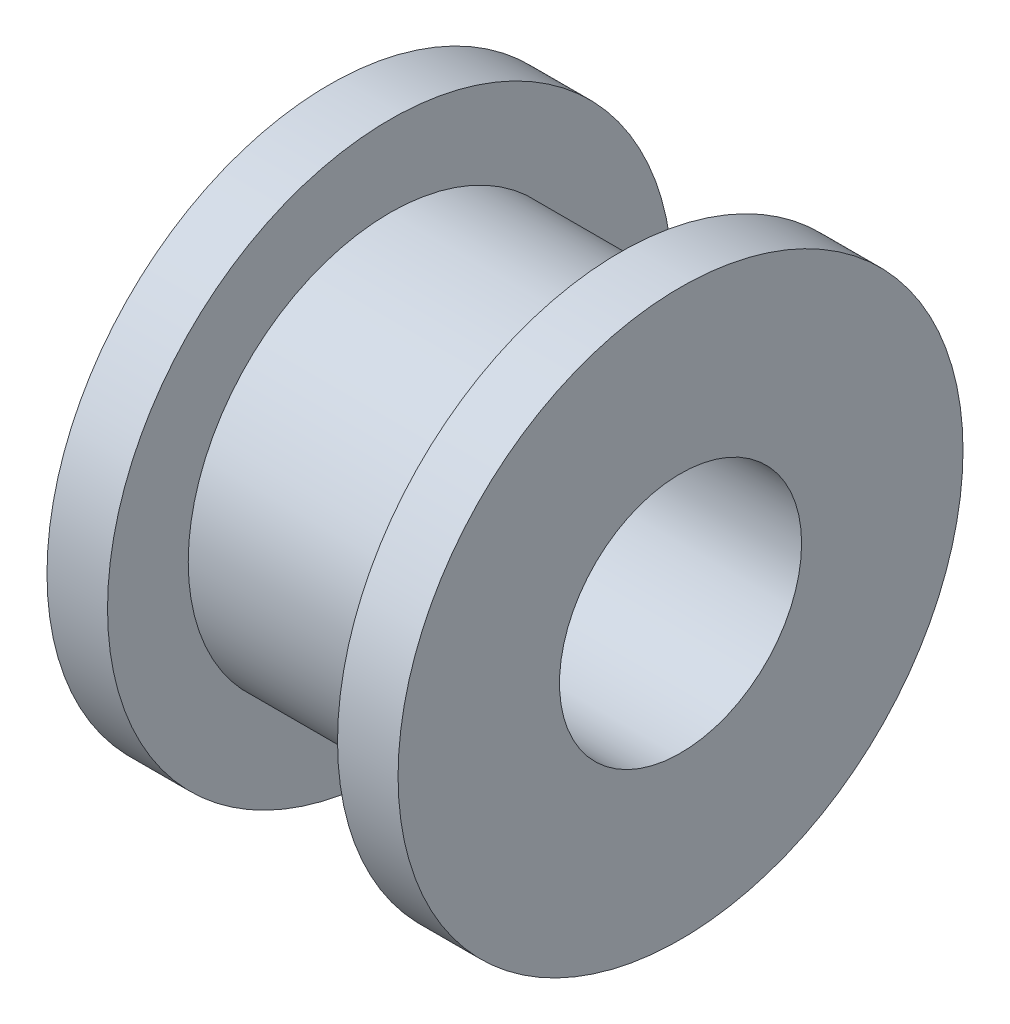
ISO-10303-21;
HEADER;
FILE_DESCRIPTION(('STEP AP214'),'2;1');
FILE_NAME('part.step','',(''),(''),'','','');
FILE_SCHEMA(('AUTOMOTIVE_DESIGN { 1 0 10303 214 1 1 1 1 }'));
ENDSEC;
DATA;
#1=APPLICATION_CONTEXT('core data for automotive mechanical design processes');
#2=APPLICATION_PROTOCOL_DEFINITION('international standard','automotive_design',2000,#1);
#3=PRODUCT_CONTEXT('',#1,'mechanical');
#4=PRODUCT('Part','Part','',(#3));
#5=PRODUCT_RELATED_PRODUCT_CATEGORY('part','',(#4));
#6=PRODUCT_DEFINITION_FORMATION('','',#4);
#7=PRODUCT_DEFINITION_CONTEXT('part definition',#1,'design');
#8=PRODUCT_DEFINITION('design','',#6,#7);
#9=PRODUCT_DEFINITION_SHAPE('','',#8);
#10=(LENGTH_UNIT() NAMED_UNIT(*) SI_UNIT(.MILLI.,.METRE.));
#11=(NAMED_UNIT(*) PLANE_ANGLE_UNIT() SI_UNIT($,.RADIAN.));
#12=(NAMED_UNIT(*) SI_UNIT($,.STERADIAN.) SOLID_ANGLE_UNIT());
#13=UNCERTAINTY_MEASURE_WITH_UNIT(LENGTH_MEASURE(1.E-05),#10,'distance_accuracy_value','');
#14=(GEOMETRIC_REPRESENTATION_CONTEXT(3) GLOBAL_UNCERTAINTY_ASSIGNED_CONTEXT((#13)) GLOBAL_UNIT_ASSIGNED_CONTEXT((#10,
#11,#12)) REPRESENTATION_CONTEXT('',''));
#15=CARTESIAN_POINT('',(0.,0.,0.));
#16=DIRECTION('',(0.,0.,1.));
#17=DIRECTION('',(1.,0.,0.));
#18=AXIS2_PLACEMENT_3D('',#15,#16,#17);
#19=CARTESIAN_POINT('',(8.7,0.,0.));
#20=DIRECTION('',(-1.,0.,0.));
#21=DIRECTION('',(0.,0.,1.));
#22=AXIS2_PLACEMENT_3D('',#19,#20,#21);
#23=CYLINDRICAL_SURFACE('',#22,5.);
#24=CARTESIAN_POINT('',(7.2,0.,0.));
#25=DIRECTION('',(1.,0.,0.));
#26=DIRECTION('',(0.,0.,-1.));
#27=AXIS2_PLACEMENT_3D('',#24,#25,#26);
#28=CIRCLE('',#27,5.);
#29=CARTESIAN_POINT('',(7.2,0.,-5.));
#30=VERTEX_POINT('',#29);
#31=EDGE_CURVE('E38',#30,#30,#28,.T.);
#32=ORIENTED_EDGE('',*,*,#31,.F.);
#33=EDGE_LOOP('',(#32));
#34=FACE_BOUND('',#33,.T.);
#35=CARTESIAN_POINT('',(1.5,0.,0.));
#36=DIRECTION('',(-1.,0.,0.));
#37=DIRECTION('',(0.,0.,1.));
#38=AXIS2_PLACEMENT_3D('',#35,#36,#37);
#39=CIRCLE('',#38,5.);
#40=CARTESIAN_POINT('',(1.5,0.,5.));
#41=VERTEX_POINT('',#40);
#42=EDGE_CURVE('E10',#41,#41,#39,.T.);
#43=ORIENTED_EDGE('',*,*,#42,.F.);
#44=EDGE_LOOP('',(#43));
#45=FACE_BOUND('',#44,.T.);
#46=ADVANCED_FACE('F31',(#34,#45),#23,.T.);
#47=CARTESIAN_POINT('',(7.2,0.,0.));
#48=DIRECTION('',(1.,0.,0.));
#49=DIRECTION('',(0.,0.,-1.));
#50=AXIS2_PLACEMENT_3D('',#47,#48,#49);
#51=CYLINDRICAL_SURFACE('',#50,7.);
#52=CARTESIAN_POINT('',(7.2,0.,0.));
#53=DIRECTION('',(1.,0.,0.));
#54=DIRECTION('',(0.,0.,-1.));
#55=AXIS2_PLACEMENT_3D('',#52,#53,#54);
#56=CIRCLE('',#55,7.);
#57=CARTESIAN_POINT('',(7.2,0.,-7.));
#58=VERTEX_POINT('',#57);
#59=EDGE_CURVE('E42',#58,#58,#56,.T.);
#60=ORIENTED_EDGE('',*,*,#59,.T.);
#61=EDGE_LOOP('',(#60));
#62=FACE_BOUND('',#61,.T.);
#63=CARTESIAN_POINT('',(8.7,0.,0.));
#64=DIRECTION('',(1.,0.,0.));
#65=DIRECTION('',(0.,0.,-1.));
#66=AXIS2_PLACEMENT_3D('',#63,#64,#65);
#67=CIRCLE('',#66,7.);
#68=CARTESIAN_POINT('',(8.7,0.,-7.));
#69=VERTEX_POINT('',#68);
#70=EDGE_CURVE('E45',#69,#69,#67,.T.);
#71=ORIENTED_EDGE('',*,*,#70,.F.);
#72=EDGE_LOOP('',(#71));
#73=FACE_BOUND('',#72,.T.);
#74=ADVANCED_FACE('F76',(#62,#73),#51,.T.);
#75=CARTESIAN_POINT('',(7.2,0.,0.));
#76=DIRECTION('',(1.,0.,0.));
#77=DIRECTION('',(0.,0.,-1.));
#78=AXIS2_PLACEMENT_3D('',#75,#76,#77);
#79=PLANE('',#78);
#80=ORIENTED_EDGE('',*,*,#31,.T.);
#81=EDGE_LOOP('',(#80));
#82=FACE_BOUND('',#81,.T.);
#83=ORIENTED_EDGE('',*,*,#59,.F.);
#84=EDGE_LOOP('',(#83));
#85=FACE_BOUND('',#84,.T.);
#86=ADVANCED_FACE('F81',(#82,#85),#79,.F.);
#87=CARTESIAN_POINT('',(8.7,0.,0.));
#88=DIRECTION('',(1.,0.,0.));
#89=DIRECTION('',(0.,0.,-1.));
#90=AXIS2_PLACEMENT_3D('',#87,#88,#89);
#91=PLANE('',#90);
#92=CARTESIAN_POINT('',(8.7,0.,0.));
#93=DIRECTION('',(1.,0.,0.));
#94=DIRECTION('',(0.,0.,-1.));
#95=AXIS2_PLACEMENT_3D('',#92,#93,#94);
#96=CIRCLE('',#95,3.);
#97=CARTESIAN_POINT('',(8.7,0.,-3.));
#98=VERTEX_POINT('',#97);
#99=EDGE_CURVE('E56',#98,#98,#96,.T.);
#100=ORIENTED_EDGE('',*,*,#99,.F.);
#101=EDGE_LOOP('',(#100));
#102=FACE_BOUND('',#101,.T.);
#103=ORIENTED_EDGE('',*,*,#70,.T.);
#104=EDGE_LOOP('',(#103));
#105=FACE_BOUND('',#104,.T.);
#106=ADVANCED_FACE('F89',(#102,#105),#91,.T.);
#107=CARTESIAN_POINT('',(1.5,0.,0.));
#108=DIRECTION('',(-1.,0.,0.));
#109=DIRECTION('',(0.,0.,1.));
#110=AXIS2_PLACEMENT_3D('',#107,#108,#109);
#111=CYLINDRICAL_SURFACE('',#110,7.);
#112=CARTESIAN_POINT('',(1.5,0.,0.));
#113=DIRECTION('',(-1.,0.,0.));
#114=DIRECTION('',(0.,0.,1.));
#115=AXIS2_PLACEMENT_3D('',#112,#113,#114);
#116=CIRCLE('',#115,7.);
#117=CARTESIAN_POINT('',(1.5,0.,7.));
#118=VERTEX_POINT('',#117);
#119=EDGE_CURVE('E48',#118,#118,#116,.T.);
#120=ORIENTED_EDGE('',*,*,#119,.T.);
#121=EDGE_LOOP('',(#120));
#122=FACE_BOUND('',#121,.T.);
#123=CARTESIAN_POINT('',(0.,0.,0.));
#124=DIRECTION('',(-1.,0.,0.));
#125=DIRECTION('',(0.,0.,1.));
#126=AXIS2_PLACEMENT_3D('',#123,#124,#125);
#127=CIRCLE('',#126,7.);
#128=CARTESIAN_POINT('',(0.,0.,7.));
#129=VERTEX_POINT('',#128);
#130=EDGE_CURVE('E51',#129,#129,#127,.T.);
#131=ORIENTED_EDGE('',*,*,#130,.F.);
#132=EDGE_LOOP('',(#131));
#133=FACE_BOUND('',#132,.T.);
#134=ADVANCED_FACE('F96',(#122,#133),#111,.T.);
#135=CARTESIAN_POINT('',(1.5,0.,0.));
#136=DIRECTION('',(-1.,0.,0.));
#137=DIRECTION('',(0.,0.,1.));
#138=AXIS2_PLACEMENT_3D('',#135,#136,#137);
#139=PLANE('',#138);
#140=ORIENTED_EDGE('',*,*,#42,.T.);
#141=EDGE_LOOP('',(#140));
#142=FACE_BOUND('',#141,.T.);
#143=ORIENTED_EDGE('',*,*,#119,.F.);
#144=EDGE_LOOP('',(#143));
#145=FACE_BOUND('',#144,.T.);
#146=ADVANCED_FACE('F73',(#142,#145),#139,.F.);
#147=CARTESIAN_POINT('',(0.,0.,0.));
#148=DIRECTION('',(1.,0.,0.));
#149=DIRECTION('',(0.,0.,-1.));
#150=AXIS2_PLACEMENT_3D('',#147,#148,#149);
#151=PLANE('',#150);
#152=CARTESIAN_POINT('',(0.,0.,0.));
#153=DIRECTION('',(1.,0.,0.));
#154=DIRECTION('',(0.,0.,-1.));
#155=AXIS2_PLACEMENT_3D('',#152,#153,#154);
#156=CIRCLE('',#155,3.);
#157=CARTESIAN_POINT('',(0.,0.,-3.));
#158=VERTEX_POINT('',#157);
#159=EDGE_CURVE('E34',#158,#158,#156,.T.);
#160=ORIENTED_EDGE('',*,*,#159,.T.);
#161=EDGE_LOOP('',(#160));
#162=FACE_BOUND('',#161,.T.);
#163=ORIENTED_EDGE('',*,*,#130,.T.);
#164=EDGE_LOOP('',(#163));
#165=FACE_BOUND('',#164,.T.);
#166=ADVANCED_FACE('F63',(#162,#165),#151,.F.);
#167=CARTESIAN_POINT('',(-1.3,0.,0.));
#168=DIRECTION('',(1.,0.,0.));
#169=DIRECTION('',(0.,0.,-1.));
#170=AXIS2_PLACEMENT_3D('',#167,#168,#169);
#171=CYLINDRICAL_SURFACE('',#170,3.);
#172=ORIENTED_EDGE('',*,*,#99,.T.);
#173=EDGE_LOOP('',(#172));
#174=FACE_BOUND('',#173,.T.);
#175=ORIENTED_EDGE('',*,*,#159,.F.);
#176=EDGE_LOOP('',(#175));
#177=FACE_BOUND('',#176,.T.);
#178=ADVANCED_FACE('F66',(#174,#177),#171,.F.);
#179=CLOSED_SHELL('',(#46,#74,#86,#106,#134,#146,#166,#178));
#180=MANIFOLD_SOLID_BREP('B2',#179);
#181=ADVANCED_BREP_SHAPE_REPRESENTATION('',(#18,#180),#14);
#182=SHAPE_DEFINITION_REPRESENTATION(#9,#181);
ENDSEC;
END-ISO-10303-21;
